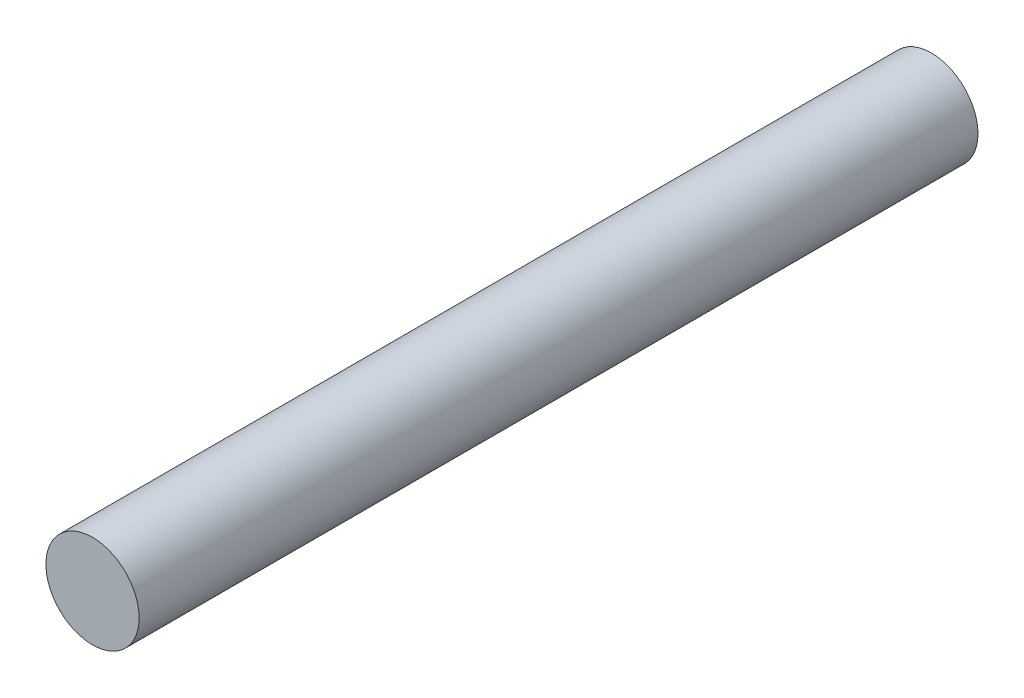
ISO-10303-21;
HEADER;
FILE_DESCRIPTION(('STEP AP214'),'2;1');
FILE_NAME('part.step','',(''),(''),'','','');
FILE_SCHEMA(('AUTOMOTIVE_DESIGN { 1 0 10303 214 1 1 1 1 }'));
ENDSEC;
DATA;
#1=APPLICATION_CONTEXT('core data for automotive mechanical design processes');
#2=APPLICATION_PROTOCOL_DEFINITION('international standard','automotive_design',2000,#1);
#3=PRODUCT_CONTEXT('',#1,'mechanical');
#4=PRODUCT('Part','Part','',(#3));
#5=PRODUCT_RELATED_PRODUCT_CATEGORY('part','',(#4));
#6=PRODUCT_DEFINITION_FORMATION('','',#4);
#7=PRODUCT_DEFINITION_CONTEXT('part definition',#1,'design');
#8=PRODUCT_DEFINITION('design','',#6,#7);
#9=PRODUCT_DEFINITION_SHAPE('','',#8);
#10=(LENGTH_UNIT() NAMED_UNIT(*) SI_UNIT(.MILLI.,.METRE.));
#11=(NAMED_UNIT(*) PLANE_ANGLE_UNIT() SI_UNIT($,.RADIAN.));
#12=(NAMED_UNIT(*) SI_UNIT($,.STERADIAN.) SOLID_ANGLE_UNIT());
#13=UNCERTAINTY_MEASURE_WITH_UNIT(LENGTH_MEASURE(1.E-05),#10,'distance_accuracy_value','');
#14=(GEOMETRIC_REPRESENTATION_CONTEXT(3) GLOBAL_UNCERTAINTY_ASSIGNED_CONTEXT((#13)) GLOBAL_UNIT_ASSIGNED_CONTEXT((#10,
#11,#12)) REPRESENTATION_CONTEXT('',''));
#15=CARTESIAN_POINT('',(0.,0.,0.));
#16=DIRECTION('',(0.,0.,1.));
#17=DIRECTION('',(1.,0.,0.));
#18=AXIS2_PLACEMENT_3D('',#15,#16,#17);
#19=CARTESIAN_POINT('',(0.,0.,54.));
#20=DIRECTION('',(0.,0.,-1.));
#21=DIRECTION('',(-1.,0.,0.));
#22=AXIS2_PLACEMENT_3D('',#19,#20,#21);
#23=CYLINDRICAL_SURFACE('',#22,3.);
#24=CARTESIAN_POINT('',(0.,0.,54.));
#25=DIRECTION('',(0.,0.,1.));
#26=DIRECTION('',(1.,0.,0.));
#27=AXIS2_PLACEMENT_3D('',#24,#25,#26);
#28=CIRCLE('',#27,3.);
#29=CARTESIAN_POINT('',(3.,0.,54.));
#30=VERTEX_POINT('',#29);
#31=EDGE_CURVE('E10',#30,#30,#28,.T.);
#32=ORIENTED_EDGE('',*,*,#31,.F.);
#33=EDGE_LOOP('',(#32));
#34=FACE_BOUND('',#33,.T.);
#35=CARTESIAN_POINT('',(0.,0.,0.));
#36=DIRECTION('',(0.,0.,1.));
#37=DIRECTION('',(1.,0.,0.));
#38=AXIS2_PLACEMENT_3D('',#35,#36,#37);
#39=CIRCLE('',#38,3.);
#40=CARTESIAN_POINT('',(3.,0.,0.));
#41=VERTEX_POINT('',#40);
#42=EDGE_CURVE('E34',#41,#41,#39,.T.);
#43=ORIENTED_EDGE('',*,*,#42,.T.);
#44=EDGE_LOOP('',(#43));
#45=FACE_BOUND('',#44,.T.);
#46=ADVANCED_FACE('F31',(#34,#45),#23,.T.);
#47=CARTESIAN_POINT('',(0.,0.,54.));
#48=DIRECTION('',(0.,0.,1.));
#49=DIRECTION('',(1.,0.,0.));
#50=AXIS2_PLACEMENT_3D('',#47,#48,#49);
#51=PLANE('',#50);
#52=ORIENTED_EDGE('',*,*,#31,.T.);
#53=EDGE_LOOP('',(#52));
#54=FACE_BOUND('',#53,.T.);
#55=ADVANCED_FACE('F46',(#54),#51,.T.);
#56=CARTESIAN_POINT('',(0.,0.,0.));
#57=DIRECTION('',(0.,0.,1.));
#58=DIRECTION('',(1.,0.,0.));
#59=AXIS2_PLACEMENT_3D('',#56,#57,#58);
#60=PLANE('',#59);
#61=ORIENTED_EDGE('',*,*,#42,.F.);
#62=EDGE_LOOP('',(#61));
#63=FACE_BOUND('',#62,.T.);
#64=ADVANCED_FACE('F44',(#63),#60,.F.);
#65=CLOSED_SHELL('',(#46,#55,#64));
#66=MANIFOLD_SOLID_BREP('B2',#65);
#67=ADVANCED_BREP_SHAPE_REPRESENTATION('',(#18,#66),#14);
#68=SHAPE_DEFINITION_REPRESENTATION(#9,#67);
ENDSEC;
END-ISO-10303-21;
